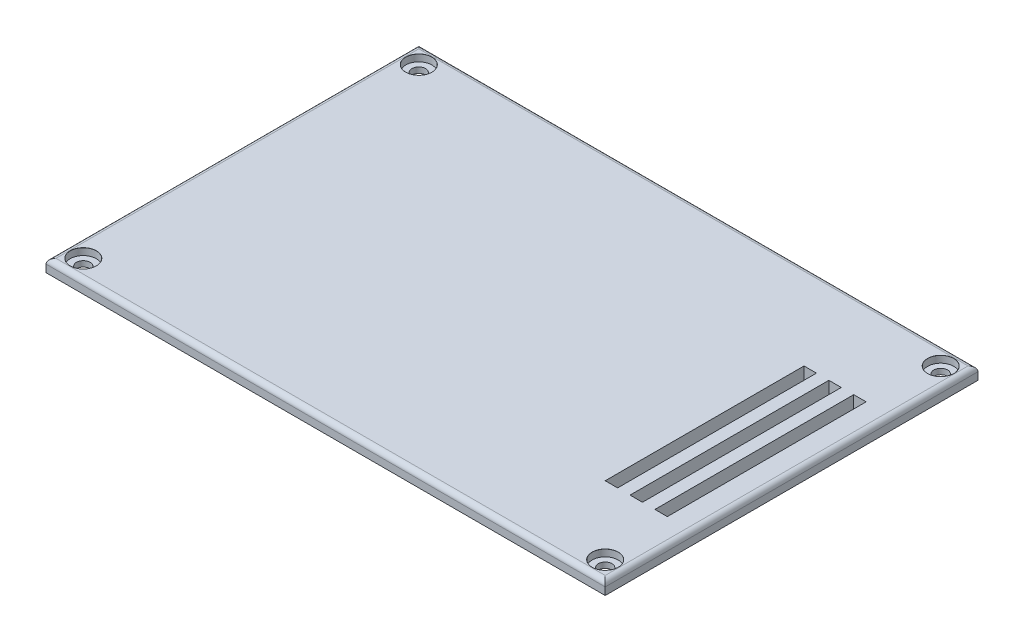
ISO-10303-21;
HEADER;
FILE_DESCRIPTION(('STEP AP214'),'2;1');
FILE_NAME('part.step','',(''),(''),'','','');
FILE_SCHEMA(('AUTOMOTIVE_DESIGN { 1 0 10303 214 1 1 1 1 }'));
ENDSEC;
DATA;
#1=APPLICATION_CONTEXT('core data for automotive mechanical design processes');
#2=APPLICATION_PROTOCOL_DEFINITION('international standard','automotive_design',2000,#1);
#3=PRODUCT_CONTEXT('',#1,'mechanical');
#4=PRODUCT('Part','Part','',(#3));
#5=PRODUCT_RELATED_PRODUCT_CATEGORY('part','',(#4));
#6=PRODUCT_DEFINITION_FORMATION('','',#4);
#7=PRODUCT_DEFINITION_CONTEXT('part definition',#1,'design');
#8=PRODUCT_DEFINITION('design','',#6,#7);
#9=PRODUCT_DEFINITION_SHAPE('','',#8);
#10=(LENGTH_UNIT() NAMED_UNIT(*) SI_UNIT(.MILLI.,.METRE.));
#11=(NAMED_UNIT(*) PLANE_ANGLE_UNIT() SI_UNIT($,.RADIAN.));
#12=(NAMED_UNIT(*) SI_UNIT($,.STERADIAN.) SOLID_ANGLE_UNIT());
#13=UNCERTAINTY_MEASURE_WITH_UNIT(LENGTH_MEASURE(1.E-05),#10,'distance_accuracy_value','');
#14=(GEOMETRIC_REPRESENTATION_CONTEXT(3) GLOBAL_UNCERTAINTY_ASSIGNED_CONTEXT((#13)) GLOBAL_UNIT_ASSIGNED_CONTEXT((#10,
#11,#12)) REPRESENTATION_CONTEXT('',''));
#15=CARTESIAN_POINT('',(0.,0.,0.));
#16=DIRECTION('',(0.,0.,1.));
#17=DIRECTION('',(1.,0.,0.));
#18=AXIS2_PLACEMENT_3D('',#15,#16,#17);
#19=CARTESIAN_POINT('',(0.,5.,0.));
#20=DIRECTION('',(0.,1.,0.));
#21=DIRECTION('',(0.,0.,1.));
#22=AXIS2_PLACEMENT_3D('',#19,#20,#21);
#23=PLANE('',#22);
#24=DIRECTION('',(1.,0.,0.));
#25=VECTOR('',#24,1.);
#26=CARTESIAN_POINT('',(112.5,5.,73.));
#27=LINE('',#26,#25);
#28=CARTESIAN_POINT('',(-110.5,5.,73.));
#29=VERTEX_POINT('',#28);
#30=CARTESIAN_POINT('',(110.5,5.,73.));
#31=VERTEX_POINT('',#30);
#32=EDGE_CURVE('E337',#29,#31,#27,.T.);
#33=ORIENTED_EDGE('',*,*,#32,.T.);
#34=DIRECTION('',(0.,0.,-1.));
#35=VECTOR('',#34,1.);
#36=CARTESIAN_POINT('',(110.5,5.,-75.));
#37=LINE('',#36,#35);
#38=CARTESIAN_POINT('',(110.5,5.,-73.));
#39=VERTEX_POINT('',#38);
#40=EDGE_CURVE('E346',#31,#39,#37,.T.);
#41=ORIENTED_EDGE('',*,*,#40,.T.);
#42=DIRECTION('',(-1.,0.,0.));
#43=VECTOR('',#42,1.);
#44=CARTESIAN_POINT('',(-112.5,5.,-73.));
#45=LINE('',#44,#43);
#46=CARTESIAN_POINT('',(-110.5,5.,-73.));
#47=VERTEX_POINT('',#46);
#48=EDGE_CURVE('E343',#39,#47,#45,.T.);
#49=ORIENTED_EDGE('',*,*,#48,.T.);
#50=DIRECTION('',(0.,0.,1.));
#51=VECTOR('',#50,1.);
#52=CARTESIAN_POINT('',(-110.5,5.,75.));
#53=LINE('',#52,#51);
#54=EDGE_CURVE('E340',#47,#29,#53,.T.);
#55=ORIENTED_EDGE('',*,*,#54,.T.);
#56=EDGE_LOOP('',(#33,#41,#49,#55));
#57=FACE_BOUND('',#56,.T.);
#58=CARTESIAN_POINT('',(-105.,5.,-67.5));
#59=DIRECTION('',(0.,1.,0.));
#60=DIRECTION('',(0.,0.,1.));
#61=AXIS2_PLACEMENT_3D('',#58,#59,#60);
#62=CIRCLE('',#61,5.275);
#63=CARTESIAN_POINT('',(-105.,5.,-62.225));
#64=VERTEX_POINT('',#63);
#65=EDGE_CURVE('E373',#64,#64,#62,.T.);
#66=ORIENTED_EDGE('',*,*,#65,.F.);
#67=EDGE_LOOP('',(#66));
#68=FACE_BOUND('',#67,.T.);
#69=CARTESIAN_POINT('',(105.,5.,-67.5));
#70=DIRECTION('',(0.,1.,0.));
#71=DIRECTION('',(0.,0.,1.));
#72=AXIS2_PLACEMENT_3D('',#69,#70,#71);
#73=CIRCLE('',#72,5.275);
#74=CARTESIAN_POINT('',(105.,5.,-62.225));
#75=VERTEX_POINT('',#74);
#76=EDGE_CURVE('E399',#75,#75,#73,.T.);
#77=ORIENTED_EDGE('',*,*,#76,.F.);
#78=EDGE_LOOP('',(#77));
#79=FACE_BOUND('',#78,.T.);
#80=CARTESIAN_POINT('',(-105.,5.,67.5));
#81=DIRECTION('',(0.,1.,0.));
#82=DIRECTION('',(0.,0.,1.));
#83=AXIS2_PLACEMENT_3D('',#80,#81,#82);
#84=CIRCLE('',#83,5.275);
#85=CARTESIAN_POINT('',(-105.,5.,72.775));
#86=VERTEX_POINT('',#85);
#87=EDGE_CURVE('E419',#86,#86,#84,.T.);
#88=ORIENTED_EDGE('',*,*,#87,.F.);
#89=EDGE_LOOP('',(#88));
#90=FACE_BOUND('',#89,.T.);
#91=CARTESIAN_POINT('',(105.,5.,67.5));
#92=DIRECTION('',(0.,1.,0.));
#93=DIRECTION('',(0.,0.,1.));
#94=AXIS2_PLACEMENT_3D('',#91,#92,#93);
#95=CIRCLE('',#94,5.275);
#96=CARTESIAN_POINT('',(105.,5.,72.775));
#97=VERTEX_POINT('',#96);
#98=EDGE_CURVE('E439',#97,#97,#95,.T.);
#99=ORIENTED_EDGE('',*,*,#98,.F.);
#100=EDGE_LOOP('',(#99));
#101=FACE_BOUND('',#100,.T.);
#102=DIRECTION('',(1.,0.,0.));
#103=VECTOR('',#102,1.);
#104=CARTESIAN_POINT('',(97.5,5.,40.));
#105=LINE('',#104,#103);
#106=CARTESIAN_POINT('',(97.5,5.,40.));
#107=VERTEX_POINT('',#106);
#108=CARTESIAN_POINT('',(102.5,5.,40.));
#109=VERTEX_POINT('',#108);
#110=EDGE_CURVE('E270',#107,#109,#105,.T.);
#111=ORIENTED_EDGE('',*,*,#110,.F.);
#112=DIRECTION('',(0.,0.,1.));
#113=VECTOR('',#112,1.);
#114=CARTESIAN_POINT('',(97.5,5.,-40.));
#115=LINE('',#114,#113);
#116=CARTESIAN_POINT('',(97.5,5.,-40.));
#117=VERTEX_POINT('',#116);
#118=EDGE_CURVE('E267',#117,#107,#115,.T.);
#119=ORIENTED_EDGE('',*,*,#118,.F.);
#120=DIRECTION('',(-1.,0.,0.));
#121=VECTOR('',#120,1.);
#122=CARTESIAN_POINT('',(97.5,5.,-40.));
#123=LINE('',#122,#121);
#124=CARTESIAN_POINT('',(102.5,5.,-40.));
#125=VERTEX_POINT('',#124);
#126=EDGE_CURVE('E278',#125,#117,#123,.T.);
#127=ORIENTED_EDGE('',*,*,#126,.F.);
#128=DIRECTION('',(0.,0.,-1.));
#129=VECTOR('',#128,1.);
#130=CARTESIAN_POINT('',(102.5,5.,-40.));
#131=LINE('',#130,#129);
#132=EDGE_CURVE('E274',#109,#125,#131,.T.);
#133=ORIENTED_EDGE('',*,*,#132,.F.);
#134=EDGE_LOOP('',(#111,#119,#127,#133));
#135=FACE_BOUND('',#134,.T.);
#136=DIRECTION('',(1.,0.,0.));
#137=VECTOR('',#136,1.);
#138=CARTESIAN_POINT('',(87.5,5.,40.));
#139=LINE('',#138,#137);
#140=CARTESIAN_POINT('',(87.5,5.,40.));
#141=VERTEX_POINT('',#140);
#142=CARTESIAN_POINT('',(92.5,5.,40.));
#143=VERTEX_POINT('',#142);
#144=EDGE_CURVE('E227',#141,#143,#139,.T.);
#145=ORIENTED_EDGE('',*,*,#144,.F.);
#146=DIRECTION('',(0.,0.,1.));
#147=VECTOR('',#146,1.);
#148=CARTESIAN_POINT('',(87.5,5.,-40.));
#149=LINE('',#148,#147);
#150=CARTESIAN_POINT('',(87.5,5.,-40.));
#151=VERTEX_POINT('',#150);
#152=EDGE_CURVE('E224',#151,#141,#149,.T.);
#153=ORIENTED_EDGE('',*,*,#152,.F.);
#154=DIRECTION('',(-1.,0.,0.));
#155=VECTOR('',#154,1.);
#156=CARTESIAN_POINT('',(87.5,5.,-40.));
#157=LINE('',#156,#155);
#158=CARTESIAN_POINT('',(92.5,5.,-40.));
#159=VERTEX_POINT('',#158);
#160=EDGE_CURVE('E235',#159,#151,#157,.T.);
#161=ORIENTED_EDGE('',*,*,#160,.F.);
#162=DIRECTION('',(0.,0.,-1.));
#163=VECTOR('',#162,1.);
#164=CARTESIAN_POINT('',(92.5,5.,-40.));
#165=LINE('',#164,#163);
#166=EDGE_CURVE('E231',#143,#159,#165,.T.);
#167=ORIENTED_EDGE('',*,*,#166,.F.);
#168=EDGE_LOOP('',(#145,#153,#161,#167));
#169=FACE_BOUND('',#168,.T.);
#170=DIRECTION('',(1.,0.,0.));
#171=VECTOR('',#170,1.);
#172=CARTESIAN_POINT('',(77.5,5.,40.));
#173=LINE('',#172,#171);
#174=CARTESIAN_POINT('',(77.5,5.,40.));
#175=VERTEX_POINT('',#174);
#176=CARTESIAN_POINT('',(82.5,5.,40.));
#177=VERTEX_POINT('',#176);
#178=EDGE_CURVE('E180',#175,#177,#173,.T.);
#179=ORIENTED_EDGE('',*,*,#178,.F.);
#180=DIRECTION('',(0.,0.,1.));
#181=VECTOR('',#180,1.);
#182=CARTESIAN_POINT('',(77.5,5.,-40.));
#183=LINE('',#182,#181);
#184=CARTESIAN_POINT('',(77.5,5.,-40.));
#185=VERTEX_POINT('',#184);
#186=EDGE_CURVE('E169',#185,#175,#183,.T.);
#187=ORIENTED_EDGE('',*,*,#186,.F.);
#188=DIRECTION('',(-1.,0.,0.));
#189=VECTOR('',#188,1.);
#190=CARTESIAN_POINT('',(77.5,5.,-40.));
#191=LINE('',#190,#189);
#192=CARTESIAN_POINT('',(82.5,5.,-40.));
#193=VERTEX_POINT('',#192);
#194=EDGE_CURVE('E198',#193,#185,#191,.T.);
#195=ORIENTED_EDGE('',*,*,#194,.F.);
#196=DIRECTION('',(0.,0.,-1.));
#197=VECTOR('',#196,1.);
#198=CARTESIAN_POINT('',(82.5,5.,-40.));
#199=LINE('',#198,#197);
#200=EDGE_CURVE('E194',#177,#193,#199,.T.);
#201=ORIENTED_EDGE('',*,*,#200,.F.);
#202=EDGE_LOOP('',(#179,#187,#195,#201));
#203=FACE_BOUND('',#202,.T.);
#204=ADVANCED_FACE('F42',(#57,#68,#79,#90,#101,#135,#169,#203),#23,.T.);
#205=CARTESIAN_POINT('',(0.,0.,0.));
#206=DIRECTION('',(0.,1.,0.));
#207=DIRECTION('',(0.,0.,1.));
#208=AXIS2_PLACEMENT_3D('',#205,#206,#207);
#209=PLANE('',#208);
#210=CARTESIAN_POINT('',(-105.,0.,-67.5));
#211=DIRECTION('',(0.,1.,0.));
#212=DIRECTION('',(0.,0.,1.));
#213=AXIS2_PLACEMENT_3D('',#210,#211,#212);
#214=CIRCLE('',#213,2.75);
#215=CARTESIAN_POINT('',(-105.,0.,-64.75));
#216=VERTEX_POINT('',#215);
#217=EDGE_CURVE('E395',#216,#216,#214,.T.);
#218=ORIENTED_EDGE('',*,*,#217,.T.);
#219=EDGE_LOOP('',(#218));
#220=FACE_BOUND('',#219,.T.);
#221=CARTESIAN_POINT('',(105.,0.,-67.5));
#222=DIRECTION('',(0.,1.,0.));
#223=DIRECTION('',(0.,0.,1.));
#224=AXIS2_PLACEMENT_3D('',#221,#222,#223);
#225=CIRCLE('',#224,2.75);
#226=CARTESIAN_POINT('',(105.,0.,-64.75));
#227=VERTEX_POINT('',#226);
#228=EDGE_CURVE('E415',#227,#227,#225,.T.);
#229=ORIENTED_EDGE('',*,*,#228,.T.);
#230=EDGE_LOOP('',(#229));
#231=FACE_BOUND('',#230,.T.);
#232=CARTESIAN_POINT('',(-105.,0.,67.5));
#233=DIRECTION('',(0.,1.,0.));
#234=DIRECTION('',(0.,0.,1.));
#235=AXIS2_PLACEMENT_3D('',#232,#233,#234);
#236=CIRCLE('',#235,2.75);
#237=CARTESIAN_POINT('',(-105.,0.,70.25));
#238=VERTEX_POINT('',#237);
#239=EDGE_CURVE('E435',#238,#238,#236,.T.);
#240=ORIENTED_EDGE('',*,*,#239,.T.);
#241=EDGE_LOOP('',(#240));
#242=FACE_BOUND('',#241,.T.);
#243=CARTESIAN_POINT('',(105.,0.,67.5));
#244=DIRECTION('',(0.,1.,0.));
#245=DIRECTION('',(0.,0.,1.));
#246=AXIS2_PLACEMENT_3D('',#243,#244,#245);
#247=CIRCLE('',#246,2.75);
#248=CARTESIAN_POINT('',(105.,0.,70.25));
#249=VERTEX_POINT('',#248);
#250=EDGE_CURVE('E207',#249,#249,#247,.T.);
#251=ORIENTED_EDGE('',*,*,#250,.T.);
#252=EDGE_LOOP('',(#251));
#253=FACE_BOUND('',#252,.T.);
#254=DIRECTION('',(0.,0.,1.));
#255=VECTOR('',#254,1.);
#256=CARTESIAN_POINT('',(87.5,0.,-40.));
#257=LINE('',#256,#255);
#258=CARTESIAN_POINT('',(87.5,0.,-40.));
#259=VERTEX_POINT('',#258);
#260=CARTESIAN_POINT('',(87.5,0.,40.));
#261=VERTEX_POINT('',#260);
#262=EDGE_CURVE('E189',#259,#261,#257,.T.);
#263=ORIENTED_EDGE('',*,*,#262,.T.);
#264=DIRECTION('',(1.,0.,0.));
#265=VECTOR('',#264,1.);
#266=CARTESIAN_POINT('',(87.5,0.,40.));
#267=LINE('',#266,#265);
#268=CARTESIAN_POINT('',(92.5,0.,40.));
#269=VERTEX_POINT('',#268);
#270=EDGE_CURVE('E242',#261,#269,#267,.T.);
#271=ORIENTED_EDGE('',*,*,#270,.T.);
#272=DIRECTION('',(0.,0.,-1.));
#273=VECTOR('',#272,1.);
#274=CARTESIAN_POINT('',(92.5,0.,-40.));
#275=LINE('',#274,#273);
#276=CARTESIAN_POINT('',(92.5,0.,-40.));
#277=VERTEX_POINT('',#276);
#278=EDGE_CURVE('E246',#269,#277,#275,.T.);
#279=ORIENTED_EDGE('',*,*,#278,.T.);
#280=DIRECTION('',(-1.,0.,0.));
#281=VECTOR('',#280,1.);
#282=CARTESIAN_POINT('',(87.5,0.,-40.));
#283=LINE('',#282,#281);
#284=EDGE_CURVE('E228',#277,#259,#283,.T.);
#285=ORIENTED_EDGE('',*,*,#284,.T.);
#286=EDGE_LOOP('',(#263,#271,#279,#285));
#287=FACE_BOUND('',#286,.T.);
#288=DIRECTION('',(0.,0.,-1.));
#289=VECTOR('',#288,1.);
#290=CARTESIAN_POINT('',(112.5,0.,-75.));
#291=LINE('',#290,#289);
#292=CARTESIAN_POINT('',(112.5,0.,75.));
#293=VERTEX_POINT('',#292);
#294=CARTESIAN_POINT('',(112.5,0.,-75.));
#295=VERTEX_POINT('',#294);
#296=EDGE_CURVE('E309',#293,#295,#291,.T.);
#297=ORIENTED_EDGE('',*,*,#296,.F.);
#298=DIRECTION('',(1.,0.,0.));
#299=VECTOR('',#298,1.);
#300=CARTESIAN_POINT('',(-112.5,0.,75.));
#301=LINE('',#300,#299);
#302=CARTESIAN_POINT('',(-112.5,0.,75.));
#303=VERTEX_POINT('',#302);
#304=EDGE_CURVE('E321',#303,#293,#301,.T.);
#305=ORIENTED_EDGE('',*,*,#304,.F.);
#306=DIRECTION('',(0.,0.,1.));
#307=VECTOR('',#306,1.);
#308=CARTESIAN_POINT('',(-112.5,0.,-75.));
#309=LINE('',#308,#307);
#310=CARTESIAN_POINT('',(-112.5,0.,-75.));
#311=VERTEX_POINT('',#310);
#312=EDGE_CURVE('E317',#311,#303,#309,.T.);
#313=ORIENTED_EDGE('',*,*,#312,.F.);
#314=DIRECTION('',(-1.,0.,0.));
#315=VECTOR('',#314,1.);
#316=CARTESIAN_POINT('',(-112.5,0.,-75.));
#317=LINE('',#316,#315);
#318=EDGE_CURVE('E313',#295,#311,#317,.T.);
#319=ORIENTED_EDGE('',*,*,#318,.F.);
#320=EDGE_LOOP('',(#297,#305,#313,#319));
#321=FACE_BOUND('',#320,.T.);
#322=DIRECTION('',(0.,0.,1.));
#323=VECTOR('',#322,1.);
#324=CARTESIAN_POINT('',(97.5,0.,-40.));
#325=LINE('',#324,#323);
#326=CARTESIAN_POINT('',(97.5,0.,-40.));
#327=VERTEX_POINT('',#326);
#328=CARTESIAN_POINT('',(97.5,0.,40.));
#329=VERTEX_POINT('',#328);
#330=EDGE_CURVE('E266',#327,#329,#325,.T.);
#331=ORIENTED_EDGE('',*,*,#330,.T.);
#332=DIRECTION('',(1.,0.,0.));
#333=VECTOR('',#332,1.);
#334=CARTESIAN_POINT('',(97.5,0.,40.));
#335=LINE('',#334,#333);
#336=CARTESIAN_POINT('',(102.5,0.,40.));
#337=VERTEX_POINT('',#336);
#338=EDGE_CURVE('E285',#329,#337,#335,.T.);
#339=ORIENTED_EDGE('',*,*,#338,.T.);
#340=DIRECTION('',(0.,0.,-1.));
#341=VECTOR('',#340,1.);
#342=CARTESIAN_POINT('',(102.5,0.,-40.));
#343=LINE('',#342,#341);
#344=CARTESIAN_POINT('',(102.5,0.,-40.));
#345=VERTEX_POINT('',#344);
#346=EDGE_CURVE('E289',#337,#345,#343,.T.);
#347=ORIENTED_EDGE('',*,*,#346,.T.);
#348=DIRECTION('',(-1.,0.,0.));
#349=VECTOR('',#348,1.);
#350=CARTESIAN_POINT('',(97.5,0.,-40.));
#351=LINE('',#350,#349);
#352=EDGE_CURVE('E271',#345,#327,#351,.T.);
#353=ORIENTED_EDGE('',*,*,#352,.T.);
#354=EDGE_LOOP('',(#331,#339,#347,#353));
#355=FACE_BOUND('',#354,.T.);
#356=DIRECTION('',(0.,0.,1.));
#357=VECTOR('',#356,1.);
#358=CARTESIAN_POINT('',(77.5,0.,-40.));
#359=LINE('',#358,#357);
#360=CARTESIAN_POINT('',(77.5,0.,-40.));
#361=VERTEX_POINT('',#360);
#362=CARTESIAN_POINT('',(77.5,0.,40.));
#363=VERTEX_POINT('',#362);
#364=EDGE_CURVE('E204',#361,#363,#359,.T.);
#365=ORIENTED_EDGE('',*,*,#364,.T.);
#366=DIRECTION('',(1.,0.,0.));
#367=VECTOR('',#366,1.);
#368=CARTESIAN_POINT('',(77.5,0.,40.));
#369=LINE('',#368,#367);
#370=CARTESIAN_POINT('',(82.5,0.,40.));
#371=VERTEX_POINT('',#370);
#372=EDGE_CURVE('E187',#363,#371,#369,.T.);
#373=ORIENTED_EDGE('',*,*,#372,.T.);
#374=DIRECTION('',(0.,0.,-1.));
#375=VECTOR('',#374,1.);
#376=CARTESIAN_POINT('',(82.5,0.,-40.));
#377=LINE('',#376,#375);
#378=CARTESIAN_POINT('',(82.5,0.,-40.));
#379=VERTEX_POINT('',#378);
#380=EDGE_CURVE('E210',#371,#379,#377,.T.);
#381=ORIENTED_EDGE('',*,*,#380,.T.);
#382=DIRECTION('',(-1.,0.,0.));
#383=VECTOR('',#382,1.);
#384=CARTESIAN_POINT('',(77.5,0.,-40.));
#385=LINE('',#384,#383);
#386=EDGE_CURVE('E181',#379,#361,#385,.T.);
#387=ORIENTED_EDGE('',*,*,#386,.T.);
#388=EDGE_LOOP('',(#365,#373,#381,#387));
#389=FACE_BOUND('',#388,.T.);
#390=ADVANCED_FACE('F458',(#220,#231,#242,#253,#287,#321,#355,#389),#209,.F.);
#391=CARTESIAN_POINT('',(112.5,5.,-75.));
#392=DIRECTION('',(-1.,0.,0.));
#393=DIRECTION('',(0.,0.,1.));
#394=AXIS2_PLACEMENT_3D('',#391,#392,#393);
#395=PLANE('',#394);
#396=DIRECTION('',(0.,-1.,0.));
#397=VECTOR('',#396,1.);
#398=CARTESIAN_POINT('',(112.5,5.,-75.));
#399=LINE('',#398,#397);
#400=CARTESIAN_POINT('',(112.5,3.,-75.));
#401=VERTEX_POINT('',#400);
#402=EDGE_CURVE('E334',#401,#295,#399,.T.);
#403=ORIENTED_EDGE('',*,*,#402,.F.);
#404=DIRECTION('',(0.,0.,-1.));
#405=VECTOR('',#404,1.);
#406=CARTESIAN_POINT('',(112.5,3.,75.));
#407=LINE('',#406,#405);
#408=CARTESIAN_POINT('',(112.5,3.,75.));
#409=VERTEX_POINT('',#408);
#410=EDGE_CURVE('E350',#401,#409,#407,.F.);
#411=ORIENTED_EDGE('',*,*,#410,.T.);
#412=DIRECTION('',(0.,-1.,0.));
#413=VECTOR('',#412,1.);
#414=CARTESIAN_POINT('',(112.5,5.,75.));
#415=LINE('',#414,#413);
#416=EDGE_CURVE('E325',#409,#293,#415,.T.);
#417=ORIENTED_EDGE('',*,*,#416,.T.);
#418=ORIENTED_EDGE('',*,*,#296,.T.);
#419=EDGE_LOOP('',(#403,#411,#417,#418));
#420=FACE_BOUND('',#419,.T.);
#421=ADVANCED_FACE('F546',(#420),#395,.F.);
#422=CARTESIAN_POINT('',(-112.5,5.,-75.));
#423=DIRECTION('',(0.,0.,1.));
#424=DIRECTION('',(1.,0.,0.));
#425=AXIS2_PLACEMENT_3D('',#422,#423,#424);
#426=PLANE('',#425);
#427=DIRECTION('',(0.,-1.,0.));
#428=VECTOR('',#427,1.);
#429=CARTESIAN_POINT('',(-112.5,5.,-75.));
#430=LINE('',#429,#428);
#431=CARTESIAN_POINT('',(-112.5,3.,-75.));
#432=VERTEX_POINT('',#431);
#433=EDGE_CURVE('E331',#432,#311,#430,.T.);
#434=ORIENTED_EDGE('',*,*,#433,.F.);
#435=DIRECTION('',(-1.,0.,0.));
#436=VECTOR('',#435,1.);
#437=CARTESIAN_POINT('',(112.5,3.,-75.));
#438=LINE('',#437,#436);
#439=EDGE_CURVE('E354',#432,#401,#438,.F.);
#440=ORIENTED_EDGE('',*,*,#439,.T.);
#441=ORIENTED_EDGE('',*,*,#402,.T.);
#442=ORIENTED_EDGE('',*,*,#318,.T.);
#443=EDGE_LOOP('',(#434,#440,#441,#442));
#444=FACE_BOUND('',#443,.T.);
#445=ADVANCED_FACE('F553',(#444),#426,.F.);
#446=CARTESIAN_POINT('',(-112.5,5.,-75.));
#447=DIRECTION('',(1.,0.,0.));
#448=DIRECTION('',(0.,0.,-1.));
#449=AXIS2_PLACEMENT_3D('',#446,#447,#448);
#450=PLANE('',#449);
#451=DIRECTION('',(0.,-1.,0.));
#452=VECTOR('',#451,1.);
#453=CARTESIAN_POINT('',(-112.5,5.,75.));
#454=LINE('',#453,#452);
#455=CARTESIAN_POINT('',(-112.5,3.,75.));
#456=VERTEX_POINT('',#455);
#457=EDGE_CURVE('E328',#456,#303,#454,.T.);
#458=ORIENTED_EDGE('',*,*,#457,.F.);
#459=DIRECTION('',(0.,0.,1.));
#460=VECTOR('',#459,1.);
#461=CARTESIAN_POINT('',(-112.5,3.,-75.));
#462=LINE('',#461,#460);
#463=EDGE_CURVE('E52',#456,#432,#462,.F.);
#464=ORIENTED_EDGE('',*,*,#463,.T.);
#465=ORIENTED_EDGE('',*,*,#433,.T.);
#466=ORIENTED_EDGE('',*,*,#312,.T.);
#467=EDGE_LOOP('',(#458,#464,#465,#466));
#468=FACE_BOUND('',#467,.T.);
#469=ADVANCED_FACE('F550',(#468),#450,.F.);
#470=CARTESIAN_POINT('',(-112.5,5.,75.));
#471=DIRECTION('',(0.,0.,-1.));
#472=DIRECTION('',(-1.,0.,0.));
#473=AXIS2_PLACEMENT_3D('',#470,#471,#472);
#474=PLANE('',#473);
#475=ORIENTED_EDGE('',*,*,#416,.F.);
#476=DIRECTION('',(1.,0.,0.));
#477=VECTOR('',#476,1.);
#478=CARTESIAN_POINT('',(-112.5,3.,75.));
#479=LINE('',#478,#477);
#480=EDGE_CURVE('E11',#409,#456,#479,.F.);
#481=ORIENTED_EDGE('',*,*,#480,.T.);
#482=ORIENTED_EDGE('',*,*,#457,.T.);
#483=ORIENTED_EDGE('',*,*,#304,.T.);
#484=EDGE_LOOP('',(#475,#481,#482,#483));
#485=FACE_BOUND('',#484,.T.);
#486=ADVANCED_FACE('F541',(#485),#474,.F.);
#487=CARTESIAN_POINT('',(97.5,5.,-40.));
#488=DIRECTION('',(1.,0.,0.));
#489=DIRECTION('',(0.,0.,-1.));
#490=AXIS2_PLACEMENT_3D('',#487,#488,#489);
#491=PLANE('',#490);
#492=ORIENTED_EDGE('',*,*,#330,.F.);
#493=DIRECTION('',(0.,-1.,0.));
#494=VECTOR('',#493,1.);
#495=CARTESIAN_POINT('',(97.5,5.,-40.));
#496=LINE('',#495,#494);
#497=EDGE_CURVE('E281',#117,#327,#496,.T.);
#498=ORIENTED_EDGE('',*,*,#497,.F.);
#499=ORIENTED_EDGE('',*,*,#118,.T.);
#500=DIRECTION('',(0.,-1.,0.));
#501=VECTOR('',#500,1.);
#502=CARTESIAN_POINT('',(97.5,5.,40.));
#503=LINE('',#502,#501);
#504=EDGE_CURVE('E305',#107,#329,#503,.T.);
#505=ORIENTED_EDGE('',*,*,#504,.T.);
#506=EDGE_LOOP('',(#492,#498,#499,#505));
#507=FACE_BOUND('',#506,.T.);
#508=ADVANCED_FACE('F538',(#507),#491,.T.);
#509=CARTESIAN_POINT('',(97.5,5.,40.));
#510=DIRECTION('',(0.,0.,-1.));
#511=DIRECTION('',(-1.,0.,0.));
#512=AXIS2_PLACEMENT_3D('',#509,#510,#511);
#513=PLANE('',#512);
#514=ORIENTED_EDGE('',*,*,#338,.F.);
#515=ORIENTED_EDGE('',*,*,#504,.F.);
#516=ORIENTED_EDGE('',*,*,#110,.T.);
#517=DIRECTION('',(0.,-1.,0.));
#518=VECTOR('',#517,1.);
#519=CARTESIAN_POINT('',(102.5,5.,40.));
#520=LINE('',#519,#518);
#521=EDGE_CURVE('E302',#109,#337,#520,.T.);
#522=ORIENTED_EDGE('',*,*,#521,.T.);
#523=EDGE_LOOP('',(#514,#515,#516,#522));
#524=FACE_BOUND('',#523,.T.);
#525=ADVANCED_FACE('F534',(#524),#513,.T.);
#526=CARTESIAN_POINT('',(102.5,5.,-40.));
#527=DIRECTION('',(-1.,0.,0.));
#528=DIRECTION('',(0.,0.,1.));
#529=AXIS2_PLACEMENT_3D('',#526,#527,#528);
#530=PLANE('',#529);
#531=ORIENTED_EDGE('',*,*,#346,.F.);
#532=ORIENTED_EDGE('',*,*,#521,.F.);
#533=ORIENTED_EDGE('',*,*,#132,.T.);
#534=DIRECTION('',(0.,-1.,0.));
#535=VECTOR('',#534,1.);
#536=CARTESIAN_POINT('',(102.5,5.,-40.));
#537=LINE('',#536,#535);
#538=EDGE_CURVE('E299',#125,#345,#537,.T.);
#539=ORIENTED_EDGE('',*,*,#538,.T.);
#540=EDGE_LOOP('',(#531,#532,#533,#539));
#541=FACE_BOUND('',#540,.T.);
#542=ADVANCED_FACE('F530',(#541),#530,.T.);
#543=CARTESIAN_POINT('',(97.5,5.,-40.));
#544=DIRECTION('',(0.,0.,1.));
#545=DIRECTION('',(1.,0.,0.));
#546=AXIS2_PLACEMENT_3D('',#543,#544,#545);
#547=PLANE('',#546);
#548=ORIENTED_EDGE('',*,*,#352,.F.);
#549=ORIENTED_EDGE('',*,*,#538,.F.);
#550=ORIENTED_EDGE('',*,*,#126,.T.);
#551=ORIENTED_EDGE('',*,*,#497,.T.);
#552=EDGE_LOOP('',(#548,#549,#550,#551));
#553=FACE_BOUND('',#552,.T.);
#554=ADVANCED_FACE('F527',(#553),#547,.T.);
#555=CARTESIAN_POINT('',(87.5,5.,-40.));
#556=DIRECTION('',(1.,0.,0.));
#557=DIRECTION('',(0.,0.,-1.));
#558=AXIS2_PLACEMENT_3D('',#555,#556,#557);
#559=PLANE('',#558);
#560=ORIENTED_EDGE('',*,*,#262,.F.);
#561=DIRECTION('',(0.,-1.,0.));
#562=VECTOR('',#561,1.);
#563=CARTESIAN_POINT('',(87.5,5.,-40.));
#564=LINE('',#563,#562);
#565=EDGE_CURVE('E238',#151,#259,#564,.T.);
#566=ORIENTED_EDGE('',*,*,#565,.F.);
#567=ORIENTED_EDGE('',*,*,#152,.T.);
#568=DIRECTION('',(0.,-1.,0.));
#569=VECTOR('',#568,1.);
#570=CARTESIAN_POINT('',(87.5,5.,40.));
#571=LINE('',#570,#569);
#572=EDGE_CURVE('E262',#141,#261,#571,.T.);
#573=ORIENTED_EDGE('',*,*,#572,.T.);
#574=EDGE_LOOP('',(#560,#566,#567,#573));
#575=FACE_BOUND('',#574,.T.);
#576=ADVANCED_FACE('F509',(#575),#559,.T.);
#577=CARTESIAN_POINT('',(87.5,5.,40.));
#578=DIRECTION('',(0.,0.,-1.));
#579=DIRECTION('',(-1.,0.,0.));
#580=AXIS2_PLACEMENT_3D('',#577,#578,#579);
#581=PLANE('',#580);
#582=ORIENTED_EDGE('',*,*,#270,.F.);
#583=ORIENTED_EDGE('',*,*,#572,.F.);
#584=ORIENTED_EDGE('',*,*,#144,.T.);
#585=DIRECTION('',(0.,-1.,0.));
#586=VECTOR('',#585,1.);
#587=CARTESIAN_POINT('',(92.5,5.,40.));
#588=LINE('',#587,#586);
#589=EDGE_CURVE('E259',#143,#269,#588,.T.);
#590=ORIENTED_EDGE('',*,*,#589,.T.);
#591=EDGE_LOOP('',(#582,#583,#584,#590));
#592=FACE_BOUND('',#591,.T.);
#593=ADVANCED_FACE('F502',(#592),#581,.T.);
#594=CARTESIAN_POINT('',(92.5,5.,-40.));
#595=DIRECTION('',(-1.,0.,0.));
#596=DIRECTION('',(0.,0.,1.));
#597=AXIS2_PLACEMENT_3D('',#594,#595,#596);
#598=PLANE('',#597);
#599=ORIENTED_EDGE('',*,*,#278,.F.);
#600=ORIENTED_EDGE('',*,*,#589,.F.);
#601=ORIENTED_EDGE('',*,*,#166,.T.);
#602=DIRECTION('',(0.,-1.,0.));
#603=VECTOR('',#602,1.);
#604=CARTESIAN_POINT('',(92.5,5.,-40.));
#605=LINE('',#604,#603);
#606=EDGE_CURVE('E256',#159,#277,#605,.T.);
#607=ORIENTED_EDGE('',*,*,#606,.T.);
#608=EDGE_LOOP('',(#599,#600,#601,#607));
#609=FACE_BOUND('',#608,.T.);
#610=ADVANCED_FACE('F505',(#609),#598,.T.);
#611=CARTESIAN_POINT('',(87.5,5.,-40.));
#612=DIRECTION('',(0.,0.,1.));
#613=DIRECTION('',(1.,0.,0.));
#614=AXIS2_PLACEMENT_3D('',#611,#612,#613);
#615=PLANE('',#614);
#616=ORIENTED_EDGE('',*,*,#284,.F.);
#617=ORIENTED_EDGE('',*,*,#606,.F.);
#618=ORIENTED_EDGE('',*,*,#160,.T.);
#619=ORIENTED_EDGE('',*,*,#565,.T.);
#620=EDGE_LOOP('',(#616,#617,#618,#619));
#621=FACE_BOUND('',#620,.T.);
#622=ADVANCED_FACE('F512',(#621),#615,.T.);
#623=CARTESIAN_POINT('',(77.5,5.,-40.));
#624=DIRECTION('',(1.,0.,0.));
#625=DIRECTION('',(0.,0.,-1.));
#626=AXIS2_PLACEMENT_3D('',#623,#624,#625);
#627=PLANE('',#626);
#628=ORIENTED_EDGE('',*,*,#364,.F.);
#629=DIRECTION('',(0.,-1.,0.));
#630=VECTOR('',#629,1.);
#631=CARTESIAN_POINT('',(77.5,5.,-40.));
#632=LINE('',#631,#630);
#633=EDGE_CURVE('E175',#185,#361,#632,.T.);
#634=ORIENTED_EDGE('',*,*,#633,.F.);
#635=ORIENTED_EDGE('',*,*,#186,.T.);
#636=DIRECTION('',(0.,-1.,0.));
#637=VECTOR('',#636,1.);
#638=CARTESIAN_POINT('',(77.5,5.,40.));
#639=LINE('',#638,#637);
#640=EDGE_CURVE('E172',#175,#363,#639,.T.);
#641=ORIENTED_EDGE('',*,*,#640,.T.);
#642=EDGE_LOOP('',(#628,#634,#635,#641));
#643=FACE_BOUND('',#642,.T.);
#644=ADVANCED_FACE('F171',(#643),#627,.T.);
#645=CARTESIAN_POINT('',(77.5,5.,40.));
#646=DIRECTION('',(0.,0.,-1.));
#647=DIRECTION('',(-1.,0.,0.));
#648=AXIS2_PLACEMENT_3D('',#645,#646,#647);
#649=PLANE('',#648);
#650=ORIENTED_EDGE('',*,*,#372,.F.);
#651=ORIENTED_EDGE('',*,*,#640,.F.);
#652=ORIENTED_EDGE('',*,*,#178,.T.);
#653=DIRECTION('',(0.,-1.,0.));
#654=VECTOR('',#653,1.);
#655=CARTESIAN_POINT('',(82.5,5.,40.));
#656=LINE('',#655,#654);
#657=EDGE_CURVE('E190',#177,#371,#656,.T.);
#658=ORIENTED_EDGE('',*,*,#657,.T.);
#659=EDGE_LOOP('',(#650,#651,#652,#658));
#660=FACE_BOUND('',#659,.T.);
#661=ADVANCED_FACE('F184',(#660),#649,.T.);
#662=CARTESIAN_POINT('',(82.5,5.,-40.));
#663=DIRECTION('',(-1.,0.,0.));
#664=DIRECTION('',(0.,0.,1.));
#665=AXIS2_PLACEMENT_3D('',#662,#663,#664);
#666=PLANE('',#665);
#667=ORIENTED_EDGE('',*,*,#380,.F.);
#668=ORIENTED_EDGE('',*,*,#657,.F.);
#669=ORIENTED_EDGE('',*,*,#200,.T.);
#670=DIRECTION('',(0.,-1.,0.));
#671=VECTOR('',#670,1.);
#672=CARTESIAN_POINT('',(82.5,5.,-40.));
#673=LINE('',#672,#671);
#674=EDGE_CURVE('E219',#193,#379,#673,.T.);
#675=ORIENTED_EDGE('',*,*,#674,.T.);
#676=EDGE_LOOP('',(#667,#668,#669,#675));
#677=FACE_BOUND('',#676,.T.);
#678=ADVANCED_FACE('F620',(#677),#666,.T.);
#679=CARTESIAN_POINT('',(77.5,5.,-40.));
#680=DIRECTION('',(0.,0.,1.));
#681=DIRECTION('',(1.,0.,0.));
#682=AXIS2_PLACEMENT_3D('',#679,#680,#681);
#683=PLANE('',#682);
#684=ORIENTED_EDGE('',*,*,#386,.F.);
#685=ORIENTED_EDGE('',*,*,#674,.F.);
#686=ORIENTED_EDGE('',*,*,#194,.T.);
#687=ORIENTED_EDGE('',*,*,#633,.T.);
#688=EDGE_LOOP('',(#684,#685,#686,#687));
#689=FACE_BOUND('',#688,.T.);
#690=ADVANCED_FACE('F465',(#689),#683,.T.);
#691=CARTESIAN_POINT('',(105.,5.,67.5));
#692=DIRECTION('',(0.,1.,0.));
#693=DIRECTION('',(0.,0.,1.));
#694=AXIS2_PLACEMENT_3D('',#691,#692,#693);
#695=CYLINDRICAL_SURFACE('',#694,2.75);
#696=ORIENTED_EDGE('',*,*,#250,.F.);
#697=EDGE_LOOP('',(#696));
#698=FACE_BOUND('',#697,.T.);
#699=CARTESIAN_POINT('',(105.,2.25,67.5));
#700=DIRECTION('',(0.,1.,0.));
#701=DIRECTION('',(0.,0.,1.));
#702=AXIS2_PLACEMENT_3D('',#699,#700,#701);
#703=CIRCLE('',#702,2.75);
#704=CARTESIAN_POINT('',(105.,2.25,70.25));
#705=VERTEX_POINT('',#704);
#706=EDGE_CURVE('E451',#705,#705,#703,.T.);
#707=ORIENTED_EDGE('',*,*,#706,.T.);
#708=EDGE_LOOP('',(#707));
#709=FACE_BOUND('',#708,.T.);
#710=ADVANCED_FACE('F461',(#698,#709),#695,.F.);
#711=CARTESIAN_POINT('',(110.25,2.25,67.5));
#712=DIRECTION('',(0.,-1.,0.));
#713=DIRECTION('',(0.,0.,-1.));
#714=AXIS2_PLACEMENT_3D('',#711,#712,#713);
#715=PLANE('',#714);
#716=ORIENTED_EDGE('',*,*,#706,.F.);
#717=EDGE_LOOP('',(#716));
#718=FACE_BOUND('',#717,.T.);
#719=CARTESIAN_POINT('',(105.,2.25,67.5));
#720=DIRECTION('',(0.,1.,0.));
#721=DIRECTION('',(0.,0.,1.));
#722=AXIS2_PLACEMENT_3D('',#719,#720,#721);
#723=CIRCLE('',#722,5.25);
#724=CARTESIAN_POINT('',(105.,2.25,72.75));
#725=VERTEX_POINT('',#724);
#726=EDGE_CURVE('E447',#725,#725,#723,.T.);
#727=ORIENTED_EDGE('',*,*,#726,.T.);
#728=EDGE_LOOP('',(#727));
#729=FACE_BOUND('',#728,.T.);
#730=ADVANCED_FACE('F464',(#718,#729),#715,.F.);
#731=CARTESIAN_POINT('',(105.,5.,67.5));
#732=DIRECTION('',(0.,1.,0.));
#733=DIRECTION('',(0.,0.,1.));
#734=AXIS2_PLACEMENT_3D('',#731,#732,#733);
#735=CYLINDRICAL_SURFACE('',#734,5.25);
#736=ORIENTED_EDGE('',*,*,#726,.F.);
#737=EDGE_LOOP('',(#736));
#738=FACE_BOUND('',#737,.T.);
#739=CARTESIAN_POINT('',(105.,4.975,67.5));
#740=DIRECTION('',(0.,1.,0.));
#741=DIRECTION('',(0.,0.,1.));
#742=AXIS2_PLACEMENT_3D('',#739,#740,#741);
#743=CIRCLE('',#742,5.25);
#744=CARTESIAN_POINT('',(105.,4.975,72.75));
#745=VERTEX_POINT('',#744);
#746=EDGE_CURVE('E443',#745,#745,#743,.T.);
#747=ORIENTED_EDGE('',*,*,#746,.T.);
#748=EDGE_LOOP('',(#747));
#749=FACE_BOUND('',#748,.T.);
#750=ADVANCED_FACE('F471',(#738,#749),#735,.F.);
#751=CARTESIAN_POINT('',(105.,5.,67.5));
#752=DIRECTION('',(0.,1.,0.));
#753=DIRECTION('',(0.,0.,1.));
#754=AXIS2_PLACEMENT_3D('',#751,#752,#753);
#755=CONICAL_SURFACE('',#754,5.275,0.785398163397396);
#756=ORIENTED_EDGE('',*,*,#746,.F.);
#757=EDGE_LOOP('',(#756));
#758=FACE_BOUND('',#757,.T.);
#759=ORIENTED_EDGE('',*,*,#98,.T.);
#760=EDGE_LOOP('',(#759));
#761=FACE_BOUND('',#760,.T.);
#762=ADVANCED_FACE('F477',(#758,#761),#755,.F.);
#763=CARTESIAN_POINT('',(-105.,5.,67.5));
#764=DIRECTION('',(0.,1.,0.));
#765=DIRECTION('',(0.,0.,1.));
#766=AXIS2_PLACEMENT_3D('',#763,#764,#765);
#767=CYLINDRICAL_SURFACE('',#766,2.75);
#768=ORIENTED_EDGE('',*,*,#239,.F.);
#769=EDGE_LOOP('',(#768));
#770=FACE_BOUND('',#769,.T.);
#771=CARTESIAN_POINT('',(-105.,2.25,67.5));
#772=DIRECTION('',(0.,1.,0.));
#773=DIRECTION('',(0.,0.,1.));
#774=AXIS2_PLACEMENT_3D('',#771,#772,#773);
#775=CIRCLE('',#774,2.75);
#776=CARTESIAN_POINT('',(-105.,2.25,70.25));
#777=VERTEX_POINT('',#776);
#778=EDGE_CURVE('E431',#777,#777,#775,.T.);
#779=ORIENTED_EDGE('',*,*,#778,.T.);
#780=EDGE_LOOP('',(#779));
#781=FACE_BOUND('',#780,.T.);
#782=ADVANCED_FACE('F483',(#770,#781),#767,.F.);
#783=CARTESIAN_POINT('',(-99.75,2.25,67.5));
#784=DIRECTION('',(0.,-1.,0.));
#785=DIRECTION('',(0.,0.,-1.));
#786=AXIS2_PLACEMENT_3D('',#783,#784,#785);
#787=PLANE('',#786);
#788=ORIENTED_EDGE('',*,*,#778,.F.);
#789=EDGE_LOOP('',(#788));
#790=FACE_BOUND('',#789,.T.);
#791=CARTESIAN_POINT('',(-105.,2.25,67.5));
#792=DIRECTION('',(0.,1.,0.));
#793=DIRECTION('',(0.,0.,1.));
#794=AXIS2_PLACEMENT_3D('',#791,#792,#793);
#795=CIRCLE('',#794,5.25);
#796=CARTESIAN_POINT('',(-105.,2.25,72.75));
#797=VERTEX_POINT('',#796);
#798=EDGE_CURVE('E427',#797,#797,#795,.T.);
#799=ORIENTED_EDGE('',*,*,#798,.T.);
#800=EDGE_LOOP('',(#799));
#801=FACE_BOUND('',#800,.T.);
#802=ADVANCED_FACE('F606',(#790,#801),#787,.F.);
#803=CARTESIAN_POINT('',(-105.,5.,67.5));
#804=DIRECTION('',(0.,1.,0.));
#805=DIRECTION('',(0.,0.,1.));
#806=AXIS2_PLACEMENT_3D('',#803,#804,#805);
#807=CYLINDRICAL_SURFACE('',#806,5.25);
#808=ORIENTED_EDGE('',*,*,#798,.F.);
#809=EDGE_LOOP('',(#808));
#810=FACE_BOUND('',#809,.T.);
#811=CARTESIAN_POINT('',(-105.,4.975,67.5));
#812=DIRECTION('',(0.,1.,0.));
#813=DIRECTION('',(0.,0.,1.));
#814=AXIS2_PLACEMENT_3D('',#811,#812,#813);
#815=CIRCLE('',#814,5.25);
#816=CARTESIAN_POINT('',(-105.,4.975,72.75));
#817=VERTEX_POINT('',#816);
#818=EDGE_CURVE('E423',#817,#817,#815,.T.);
#819=ORIENTED_EDGE('',*,*,#818,.T.);
#820=EDGE_LOOP('',(#819));
#821=FACE_BOUND('',#820,.T.);
#822=ADVANCED_FACE('F596',(#810,#821),#807,.F.);
#823=CARTESIAN_POINT('',(-105.,5.,67.5));
#824=DIRECTION('',(0.,1.,0.));
#825=DIRECTION('',(0.,0.,1.));
#826=AXIS2_PLACEMENT_3D('',#823,#824,#825);
#827=CONICAL_SURFACE('',#826,5.275,0.785398163397396);
#828=ORIENTED_EDGE('',*,*,#818,.F.);
#829=EDGE_LOOP('',(#828));
#830=FACE_BOUND('',#829,.T.);
#831=ORIENTED_EDGE('',*,*,#87,.T.);
#832=EDGE_LOOP('',(#831));
#833=FACE_BOUND('',#832,.T.);
#834=ADVANCED_FACE('F593',(#830,#833),#827,.F.);
#835=CARTESIAN_POINT('',(105.,5.,-67.5));
#836=DIRECTION('',(0.,1.,0.));
#837=DIRECTION('',(0.,0.,1.));
#838=AXIS2_PLACEMENT_3D('',#835,#836,#837);
#839=CYLINDRICAL_SURFACE('',#838,2.75);
#840=ORIENTED_EDGE('',*,*,#228,.F.);
#841=EDGE_LOOP('',(#840));
#842=FACE_BOUND('',#841,.T.);
#843=CARTESIAN_POINT('',(105.,2.25,-67.5));
#844=DIRECTION('',(0.,1.,0.));
#845=DIRECTION('',(0.,0.,1.));
#846=AXIS2_PLACEMENT_3D('',#843,#844,#845);
#847=CIRCLE('',#846,2.75);
#848=CARTESIAN_POINT('',(105.,2.25,-64.75));
#849=VERTEX_POINT('',#848);
#850=EDGE_CURVE('E411',#849,#849,#847,.T.);
#851=ORIENTED_EDGE('',*,*,#850,.T.);
#852=EDGE_LOOP('',(#851));
#853=FACE_BOUND('',#852,.T.);
#854=ADVANCED_FACE('F595',(#842,#853),#839,.F.);
#855=CARTESIAN_POINT('',(110.25,2.25,-67.5));
#856=DIRECTION('',(0.,-1.,0.));
#857=DIRECTION('',(0.,0.,-1.));
#858=AXIS2_PLACEMENT_3D('',#855,#856,#857);
#859=PLANE('',#858);
#860=ORIENTED_EDGE('',*,*,#850,.F.);
#861=EDGE_LOOP('',(#860));
#862=FACE_BOUND('',#861,.T.);
#863=CARTESIAN_POINT('',(105.,2.25,-67.5));
#864=DIRECTION('',(0.,1.,0.));
#865=DIRECTION('',(0.,0.,1.));
#866=AXIS2_PLACEMENT_3D('',#863,#864,#865);
#867=CIRCLE('',#866,5.25);
#868=CARTESIAN_POINT('',(105.,2.25,-62.25));
#869=VERTEX_POINT('',#868);
#870=EDGE_CURVE('E407',#869,#869,#867,.T.);
#871=ORIENTED_EDGE('',*,*,#870,.T.);
#872=EDGE_LOOP('',(#871));
#873=FACE_BOUND('',#872,.T.);
#874=ADVANCED_FACE('F603',(#862,#873),#859,.F.);
#875=CARTESIAN_POINT('',(105.,5.,-67.5));
#876=DIRECTION('',(0.,1.,0.));
#877=DIRECTION('',(0.,0.,1.));
#878=AXIS2_PLACEMENT_3D('',#875,#876,#877);
#879=CYLINDRICAL_SURFACE('',#878,5.25);
#880=ORIENTED_EDGE('',*,*,#870,.F.);
#881=EDGE_LOOP('',(#880));
#882=FACE_BOUND('',#881,.T.);
#883=CARTESIAN_POINT('',(105.,4.975,-67.5));
#884=DIRECTION('',(0.,1.,0.));
#885=DIRECTION('',(0.,0.,1.));
#886=AXIS2_PLACEMENT_3D('',#883,#884,#885);
#887=CIRCLE('',#886,5.25);
#888=CARTESIAN_POINT('',(105.,4.975,-62.25));
#889=VERTEX_POINT('',#888);
#890=EDGE_CURVE('E403',#889,#889,#887,.T.);
#891=ORIENTED_EDGE('',*,*,#890,.T.);
#892=EDGE_LOOP('',(#891));
#893=FACE_BOUND('',#892,.T.);
#894=ADVANCED_FACE('F688',(#882,#893),#879,.F.);
#895=CARTESIAN_POINT('',(105.,5.,-67.5));
#896=DIRECTION('',(0.,1.,0.));
#897=DIRECTION('',(0.,0.,1.));
#898=AXIS2_PLACEMENT_3D('',#895,#896,#897);
#899=CONICAL_SURFACE('',#898,5.275,0.785398163397396);
#900=ORIENTED_EDGE('',*,*,#890,.F.);
#901=EDGE_LOOP('',(#900));
#902=FACE_BOUND('',#901,.T.);
#903=ORIENTED_EDGE('',*,*,#76,.T.);
#904=EDGE_LOOP('',(#903));
#905=FACE_BOUND('',#904,.T.);
#906=ADVANCED_FACE('F698',(#902,#905),#899,.F.);
#907=CARTESIAN_POINT('',(-105.,5.,-67.5));
#908=DIRECTION('',(0.,1.,0.));
#909=DIRECTION('',(0.,0.,1.));
#910=AXIS2_PLACEMENT_3D('',#907,#908,#909);
#911=CYLINDRICAL_SURFACE('',#910,2.75);
#912=ORIENTED_EDGE('',*,*,#217,.F.);
#913=EDGE_LOOP('',(#912));
#914=FACE_BOUND('',#913,.T.);
#915=CARTESIAN_POINT('',(-105.,2.25,-67.5));
#916=DIRECTION('',(0.,1.,0.));
#917=DIRECTION('',(0.,0.,1.));
#918=AXIS2_PLACEMENT_3D('',#915,#916,#917);
#919=CIRCLE('',#918,2.75);
#920=CARTESIAN_POINT('',(-105.,2.25,-64.75));
#921=VERTEX_POINT('',#920);
#922=EDGE_CURVE('E391',#921,#921,#919,.T.);
#923=ORIENTED_EDGE('',*,*,#922,.T.);
#924=EDGE_LOOP('',(#923));
#925=FACE_BOUND('',#924,.T.);
#926=ADVANCED_FACE('F709',(#914,#925),#911,.F.);
#927=CARTESIAN_POINT('',(-99.75,2.25,-67.5));
#928=DIRECTION('',(0.,-1.,0.));
#929=DIRECTION('',(0.,0.,-1.));
#930=AXIS2_PLACEMENT_3D('',#927,#928,#929);
#931=PLANE('',#930);
#932=ORIENTED_EDGE('',*,*,#922,.F.);
#933=EDGE_LOOP('',(#932));
#934=FACE_BOUND('',#933,.T.);
#935=CARTESIAN_POINT('',(-105.,2.25,-67.5));
#936=DIRECTION('',(0.,1.,0.));
#937=DIRECTION('',(0.,0.,1.));
#938=AXIS2_PLACEMENT_3D('',#935,#936,#937);
#939=CIRCLE('',#938,5.25);
#940=CARTESIAN_POINT('',(-105.,2.25,-62.25));
#941=VERTEX_POINT('',#940);
#942=EDGE_CURVE('E385',#941,#941,#939,.T.);
#943=ORIENTED_EDGE('',*,*,#942,.T.);
#944=EDGE_LOOP('',(#943));
#945=FACE_BOUND('',#944,.T.);
#946=ADVANCED_FACE('F720',(#934,#945),#931,.F.);
#947=CARTESIAN_POINT('',(-105.,5.,-67.5));
#948=DIRECTION('',(0.,1.,0.));
#949=DIRECTION('',(0.,0.,1.));
#950=AXIS2_PLACEMENT_3D('',#947,#948,#949);
#951=CYLINDRICAL_SURFACE('',#950,5.25);
#952=ORIENTED_EDGE('',*,*,#942,.F.);
#953=EDGE_LOOP('',(#952));
#954=FACE_BOUND('',#953,.T.);
#955=CARTESIAN_POINT('',(-105.,4.975,-67.5));
#956=DIRECTION('',(0.,1.,0.));
#957=DIRECTION('',(0.,0.,1.));
#958=AXIS2_PLACEMENT_3D('',#955,#956,#957);
#959=CIRCLE('',#958,5.25);
#960=CARTESIAN_POINT('',(-105.,4.975,-62.25));
#961=VERTEX_POINT('',#960);
#962=EDGE_CURVE('E379',#961,#961,#959,.T.);
#963=ORIENTED_EDGE('',*,*,#962,.T.);
#964=EDGE_LOOP('',(#963));
#965=FACE_BOUND('',#964,.T.);
#966=ADVANCED_FACE('F576',(#954,#965),#951,.F.);
#967=CARTESIAN_POINT('',(-105.,5.,-67.5));
#968=DIRECTION('',(0.,1.,0.));
#969=DIRECTION('',(0.,0.,1.));
#970=AXIS2_PLACEMENT_3D('',#967,#968,#969);
#971=CONICAL_SURFACE('',#970,5.275,0.785398163397396);
#972=ORIENTED_EDGE('',*,*,#962,.F.);
#973=EDGE_LOOP('',(#972));
#974=FACE_BOUND('',#973,.T.);
#975=ORIENTED_EDGE('',*,*,#65,.T.);
#976=EDGE_LOOP('',(#975));
#977=FACE_BOUND('',#976,.T.);
#978=ADVANCED_FACE('F571',(#974,#977),#971,.F.);
#979=CARTESIAN_POINT('',(-110.5,3.,0.));
#980=DIRECTION('',(0.,0.,-1.));
#981=DIRECTION('',(-1.,0.,0.));
#982=AXIS2_PLACEMENT_3D('',#979,#980,#981);
#983=CYLINDRICAL_SURFACE('',#982,2.);
#984=CARTESIAN_POINT('',(-110.5,3.,-73.));
#985=DIRECTION('',(0.707106781186548,0.,-0.707106781186547));
#986=DIRECTION('',(-0.707106781186547,0.,-0.707106781186547));
#987=AXIS2_PLACEMENT_3D('',#984,#985,#986);
#988=ELLIPSE('',#987,2.82842712474619,2.);
#989=EDGE_CURVE('E364',#432,#47,#988,.T.);
#990=ORIENTED_EDGE('',*,*,#989,.F.);
#991=ORIENTED_EDGE('',*,*,#463,.F.);
#992=CARTESIAN_POINT('',(-110.5,3.,73.));
#993=DIRECTION('',(-0.707106781186548,0.,-0.707106781186547));
#994=DIRECTION('',(-0.707106781186547,0.,0.707106781186547));
#995=AXIS2_PLACEMENT_3D('',#992,#993,#994);
#996=ELLIPSE('',#995,2.82842712474619,2.);
#997=EDGE_CURVE('E46',#29,#456,#996,.F.);
#998=ORIENTED_EDGE('',*,*,#997,.F.);
#999=ORIENTED_EDGE('',*,*,#54,.F.);
#1000=EDGE_LOOP('',(#990,#991,#998,#999));
#1001=FACE_BOUND('',#1000,.T.);
#1002=ADVANCED_FACE('F44',(#1001),#983,.T.);
#1003=CARTESIAN_POINT('',(0.,3.,73.));
#1004=DIRECTION('',(-1.,0.,0.));
#1005=DIRECTION('',(0.,0.,1.));
#1006=AXIS2_PLACEMENT_3D('',#1003,#1004,#1005);
#1007=CYLINDRICAL_SURFACE('',#1006,2.);
#1008=ORIENTED_EDGE('',*,*,#997,.T.);
#1009=ORIENTED_EDGE('',*,*,#480,.F.);
#1010=CARTESIAN_POINT('',(110.5,3.,73.));
#1011=DIRECTION('',(-0.707106781186547,0.,0.707106781186547));
#1012=DIRECTION('',(-0.707106781186548,0.,-0.707106781186547));
#1013=AXIS2_PLACEMENT_3D('',#1010,#1011,#1012);
#1014=ELLIPSE('',#1013,2.82842712474619,2.);
#1015=EDGE_CURVE('E362',#31,#409,#1014,.F.);
#1016=ORIENTED_EDGE('',*,*,#1015,.F.);
#1017=ORIENTED_EDGE('',*,*,#32,.F.);
#1018=EDGE_LOOP('',(#1008,#1009,#1016,#1017));
#1019=FACE_BOUND('',#1018,.T.);
#1020=ADVANCED_FACE('F566',(#1019),#1007,.T.);
#1021=CARTESIAN_POINT('',(0.,3.,-73.));
#1022=DIRECTION('',(1.,0.,0.));
#1023=DIRECTION('',(0.,0.,-1.));
#1024=AXIS2_PLACEMENT_3D('',#1021,#1022,#1023);
#1025=CYLINDRICAL_SURFACE('',#1024,2.);
#1026=ORIENTED_EDGE('',*,*,#989,.T.);
#1027=ORIENTED_EDGE('',*,*,#48,.F.);
#1028=CARTESIAN_POINT('',(110.5,3.,-73.));
#1029=DIRECTION('',(0.707106781186547,0.,0.707106781186547));
#1030=DIRECTION('',(0.707106781186548,0.,-0.707106781186547));
#1031=AXIS2_PLACEMENT_3D('',#1028,#1029,#1030);
#1032=ELLIPSE('',#1031,2.82842712474619,2.);
#1033=EDGE_CURVE('E359',#401,#39,#1032,.T.);
#1034=ORIENTED_EDGE('',*,*,#1033,.F.);
#1035=ORIENTED_EDGE('',*,*,#439,.F.);
#1036=EDGE_LOOP('',(#1026,#1027,#1034,#1035));
#1037=FACE_BOUND('',#1036,.T.);
#1038=ADVANCED_FACE('F563',(#1037),#1025,.T.);
#1039=CARTESIAN_POINT('',(110.5,3.,0.));
#1040=DIRECTION('',(0.,0.,1.));
#1041=DIRECTION('',(1.,0.,0.));
#1042=AXIS2_PLACEMENT_3D('',#1039,#1040,#1041);
#1043=CYLINDRICAL_SURFACE('',#1042,2.);
#1044=ORIENTED_EDGE('',*,*,#1015,.T.);
#1045=ORIENTED_EDGE('',*,*,#410,.F.);
#1046=ORIENTED_EDGE('',*,*,#1033,.T.);
#1047=ORIENTED_EDGE('',*,*,#40,.F.);
#1048=EDGE_LOOP('',(#1044,#1045,#1046,#1047));
#1049=FACE_BOUND('',#1048,.T.);
#1050=ADVANCED_FACE('F560',(#1049),#1043,.T.);
#1051=CLOSED_SHELL('',(#204,#390,#421,#445,#469,#486,#508,#525,#542,#554,#576,#593,#610,#622,
#644,#661,#678,#690,#710,#730,#750,#762,#782,#802,#822,#834,#854,#874,#894,#906,#926,#946,#966,
#978,#1002,#1020,#1038,#1050));
#1052=MANIFOLD_SOLID_BREP('B2',#1051);
#1053=ADVANCED_BREP_SHAPE_REPRESENTATION('',(#18,#1052),#14);
#1054=SHAPE_DEFINITION_REPRESENTATION(#9,#1053);
ENDSEC;
END-ISO-10303-21;
